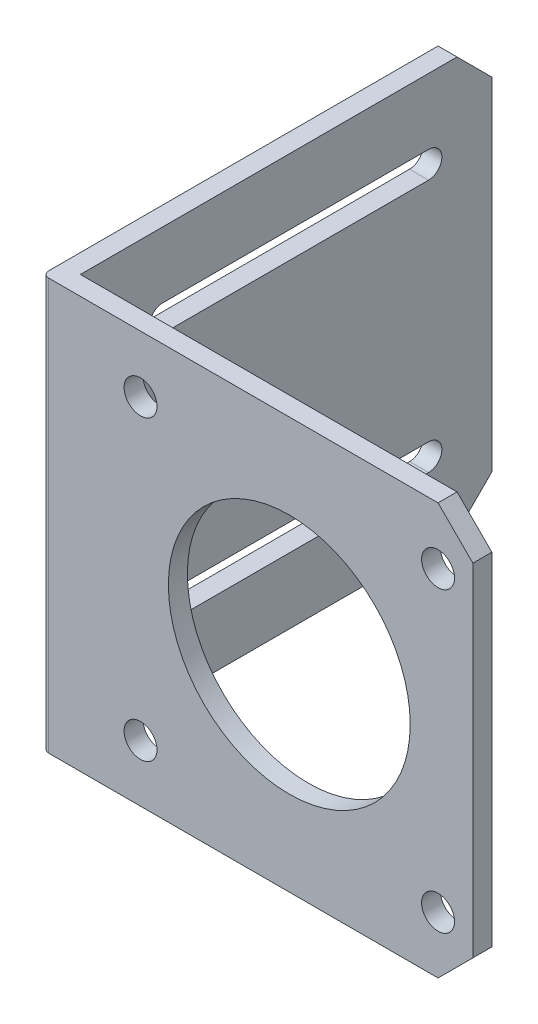
ISO-10303-21;
HEADER;
FILE_DESCRIPTION(('STEP AP214'),'2;1');
FILE_NAME('part.step','',(''),(''),'','','');
FILE_SCHEMA(('AUTOMOTIVE_DESIGN { 1 0 10303 214 1 1 1 1 }'));
ENDSEC;
DATA;
#1=APPLICATION_CONTEXT('core data for automotive mechanical design processes');
#2=APPLICATION_PROTOCOL_DEFINITION('international standard','automotive_design',2000,#1);
#3=PRODUCT_CONTEXT('',#1,'mechanical');
#4=PRODUCT('Part','Part','',(#3));
#5=PRODUCT_RELATED_PRODUCT_CATEGORY('part','',(#4));
#6=PRODUCT_DEFINITION_FORMATION('','',#4);
#7=PRODUCT_DEFINITION_CONTEXT('part definition',#1,'design');
#8=PRODUCT_DEFINITION('design','',#6,#7);
#9=PRODUCT_DEFINITION_SHAPE('','',#8);
#10=(LENGTH_UNIT() NAMED_UNIT(*) SI_UNIT(.MILLI.,.METRE.));
#11=(NAMED_UNIT(*) PLANE_ANGLE_UNIT() SI_UNIT($,.RADIAN.));
#12=(NAMED_UNIT(*) SI_UNIT($,.STERADIAN.) SOLID_ANGLE_UNIT());
#13=UNCERTAINTY_MEASURE_WITH_UNIT(LENGTH_MEASURE(1.E-05),#10,'distance_accuracy_value','');
#14=(GEOMETRIC_REPRESENTATION_CONTEXT(3) GLOBAL_UNCERTAINTY_ASSIGNED_CONTEXT((#13)) GLOBAL_UNIT_ASSIGNED_CONTEXT((#10,
#11,#12)) REPRESENTATION_CONTEXT('',''));
#15=CARTESIAN_POINT('',(0.,0.,0.));
#16=DIRECTION('',(0.,0.,1.));
#17=DIRECTION('',(1.,0.,0.));
#18=AXIS2_PLACEMENT_3D('',#15,#16,#17);
#19=CARTESIAN_POINT('',(68.,-32.5,-34.));
#20=DIRECTION('',(0.,0.,1.));
#21=DIRECTION('',(1.,0.,0.));
#22=AXIS2_PLACEMENT_3D('',#19,#20,#21);
#23=PLANE('',#22);
#24=DIRECTION('',(0.,1.,0.));
#25=VECTOR('',#24,1.);
#26=CARTESIAN_POINT('',(0.,-32.5,-34.));
#27=LINE('',#26,#25);
#28=CARTESIAN_POINT('',(0.,-27.,-34.));
#29=VERTEX_POINT('',#28);
#30=CARTESIAN_POINT('',(0.,27.,-34.));
#31=VERTEX_POINT('',#30);
#32=EDGE_CURVE('E195',#29,#31,#27,.T.);
#33=ORIENTED_EDGE('',*,*,#32,.T.);
#34=DIRECTION('',(1.,0.,0.));
#35=VECTOR('',#34,1.);
#36=CARTESIAN_POINT('',(-48.,27.,-34.));
#37=LINE('',#36,#35);
#38=CARTESIAN_POINT('',(3.,27.,-34.));
#39=VERTEX_POINT('',#38);
#40=EDGE_CURVE('E179',#31,#39,#37,.T.);
#41=ORIENTED_EDGE('',*,*,#40,.T.);
#42=DIRECTION('',(0.,1.,0.));
#43=VECTOR('',#42,1.);
#44=CARTESIAN_POINT('',(3.,-32.5,-34.));
#45=LINE('',#44,#43);
#46=CARTESIAN_POINT('',(3.,-27.,-34.));
#47=VERTEX_POINT('',#46);
#48=EDGE_CURVE('E193',#47,#39,#45,.T.);
#49=ORIENTED_EDGE('',*,*,#48,.F.);
#50=DIRECTION('',(1.,0.,0.));
#51=VECTOR('',#50,1.);
#52=CARTESIAN_POINT('',(-48.,-27.,-34.));
#53=LINE('',#52,#51);
#54=EDGE_CURVE('E325',#29,#47,#53,.T.);
#55=ORIENTED_EDGE('',*,*,#54,.F.);
#56=EDGE_LOOP('',(#33,#41,#49,#55));
#57=FACE_BOUND('',#56,.T.);
#58=ADVANCED_FACE('F45',(#57),#23,.F.);
#59=CARTESIAN_POINT('',(68.,-32.5,34.));
#60=DIRECTION('',(0.,0.,-1.));
#61=DIRECTION('',(-1.,0.,0.));
#62=AXIS2_PLACEMENT_3D('',#59,#60,#61);
#63=PLANE('',#62);
#64=CARTESIAN_POINT('',(15.5,-23.5,34.));
#65=DIRECTION('',(0.,0.,-1.));
#66=DIRECTION('',(-1.,0.,0.));
#67=AXIS2_PLACEMENT_3D('',#64,#65,#66);
#68=CIRCLE('',#67,2.6);
#69=CARTESIAN_POINT('',(12.9,-23.5,34.));
#70=VERTEX_POINT('',#69);
#71=EDGE_CURVE('E221',#70,#70,#68,.T.);
#72=ORIENTED_EDGE('',*,*,#71,.T.);
#73=EDGE_LOOP('',(#72));
#74=FACE_BOUND('',#73,.T.);
#75=CARTESIAN_POINT('',(39.,0.,34.));
#76=DIRECTION('',(0.,0.,-1.));
#77=DIRECTION('',(-1.,0.,0.));
#78=AXIS2_PLACEMENT_3D('',#75,#76,#77);
#79=CIRCLE('',#78,19.1);
#80=CARTESIAN_POINT('',(19.9,0.,34.));
#81=VERTEX_POINT('',#80);
#82=EDGE_CURVE('E423',#81,#81,#79,.T.);
#83=ORIENTED_EDGE('',*,*,#82,.T.);
#84=EDGE_LOOP('',(#83));
#85=FACE_BOUND('',#84,.T.);
#86=CARTESIAN_POINT('',(15.5,23.5,34.));
#87=DIRECTION('',(0.,0.,-1.));
#88=DIRECTION('',(-1.,0.,0.));
#89=AXIS2_PLACEMENT_3D('',#86,#87,#88);
#90=CIRCLE('',#89,2.6);
#91=CARTESIAN_POINT('',(12.9,23.5,34.));
#92=VERTEX_POINT('',#91);
#93=EDGE_CURVE('E419',#92,#92,#90,.T.);
#94=ORIENTED_EDGE('',*,*,#93,.T.);
#95=EDGE_LOOP('',(#94));
#96=FACE_BOUND('',#95,.T.);
#97=CARTESIAN_POINT('',(62.5,-23.5,34.));
#98=DIRECTION('',(0.,0.,-1.));
#99=DIRECTION('',(-1.,0.,0.));
#100=AXIS2_PLACEMENT_3D('',#97,#98,#99);
#101=CIRCLE('',#100,2.6);
#102=CARTESIAN_POINT('',(59.9,-23.5,34.));
#103=VERTEX_POINT('',#102);
#104=EDGE_CURVE('E415',#103,#103,#101,.T.);
#105=ORIENTED_EDGE('',*,*,#104,.T.);
#106=EDGE_LOOP('',(#105));
#107=FACE_BOUND('',#106,.T.);
#108=CARTESIAN_POINT('',(62.5,23.5,34.));
#109=DIRECTION('',(0.,0.,-1.));
#110=DIRECTION('',(-1.,0.,0.));
#111=AXIS2_PLACEMENT_3D('',#108,#109,#110);
#112=CIRCLE('',#111,2.6);
#113=CARTESIAN_POINT('',(59.9,23.5,34.));
#114=VERTEX_POINT('',#113);
#115=EDGE_CURVE('E407',#114,#114,#112,.T.);
#116=ORIENTED_EDGE('',*,*,#115,.T.);
#117=EDGE_LOOP('',(#116));
#118=FACE_BOUND('',#117,.T.);
#119=DIRECTION('',(0.,-1.,0.));
#120=VECTOR('',#119,1.);
#121=CARTESIAN_POINT('',(68.,-32.5,34.));
#122=LINE('',#121,#120);
#123=CARTESIAN_POINT('',(68.,27.,34.));
#124=VERTEX_POINT('',#123);
#125=CARTESIAN_POINT('',(68.,-27.,34.));
#126=VERTEX_POINT('',#125);
#127=EDGE_CURVE('E226',#124,#126,#122,.T.);
#128=ORIENTED_EDGE('',*,*,#127,.F.);
#129=DIRECTION('',(-0.707106781186548,0.707106781186548,0.));
#130=VECTOR('',#129,1.);
#131=CARTESIAN_POINT('',(97.75,-2.75,34.));
#132=LINE('',#131,#130);
#133=CARTESIAN_POINT('',(62.5,32.5,34.));
#134=VERTEX_POINT('',#133);
#135=EDGE_CURVE('E427',#124,#134,#132,.T.);
#136=ORIENTED_EDGE('',*,*,#135,.T.);
#137=DIRECTION('',(-1.,0.,0.));
#138=VECTOR('',#137,1.);
#139=CARTESIAN_POINT('',(68.,32.5,34.));
#140=LINE('',#139,#138);
#141=CARTESIAN_POINT('',(1.,32.5,34.));
#142=VERTEX_POINT('',#141);
#143=EDGE_CURVE('E230',#134,#142,#140,.T.);
#144=ORIENTED_EDGE('',*,*,#143,.T.);
#145=DIRECTION('',(0.,-1.,0.));
#146=VECTOR('',#145,1.);
#147=CARTESIAN_POINT('',(1.,-32.5,34.));
#148=LINE('',#147,#146);
#149=CARTESIAN_POINT('',(1.,-32.5,34.));
#150=VERTEX_POINT('',#149);
#151=EDGE_CURVE('E244',#142,#150,#148,.T.);
#152=ORIENTED_EDGE('',*,*,#151,.T.);
#153=DIRECTION('',(-1.,0.,0.));
#154=VECTOR('',#153,1.);
#155=CARTESIAN_POINT('',(68.,-32.5,34.));
#156=LINE('',#155,#154);
#157=CARTESIAN_POINT('',(62.5,-32.5,34.));
#158=VERTEX_POINT('',#157);
#159=EDGE_CURVE('E241',#158,#150,#156,.T.);
#160=ORIENTED_EDGE('',*,*,#159,.F.);
#161=DIRECTION('',(0.707106781186548,0.707106781186548,0.));
#162=VECTOR('',#161,1.);
#163=CARTESIAN_POINT('',(65.25,-29.75,34.));
#164=LINE('',#163,#162);
#165=EDGE_CURVE('E411',#158,#126,#164,.T.);
#166=ORIENTED_EDGE('',*,*,#165,.T.);
#167=EDGE_LOOP('',(#128,#136,#144,#152,#160,#166));
#168=FACE_BOUND('',#167,.T.);
#169=ADVANCED_FACE('F462',(#74,#85,#96,#107,#118,#168),#63,.F.);
#170=CARTESIAN_POINT('',(68.,-32.5,-34.));
#171=DIRECTION('',(0.,1.,0.));
#172=DIRECTION('',(0.,0.,1.));
#173=AXIS2_PLACEMENT_3D('',#170,#171,#172);
#174=PLANE('',#173);
#175=DIRECTION('',(0.,0.,-1.));
#176=VECTOR('',#175,1.);
#177=CARTESIAN_POINT('',(0.,-32.5,-34.));
#178=LINE('',#177,#176);
#179=CARTESIAN_POINT('',(0.,-32.5,33.));
#180=VERTEX_POINT('',#179);
#181=CARTESIAN_POINT('',(0.,-32.5,-28.5));
#182=VERTEX_POINT('',#181);
#183=EDGE_CURVE('E224',#180,#182,#178,.T.);
#184=ORIENTED_EDGE('',*,*,#183,.T.);
#185=DIRECTION('',(1.,0.,0.));
#186=VECTOR('',#185,1.);
#187=CARTESIAN_POINT('',(-48.,-32.5,-28.5));
#188=LINE('',#187,#186);
#189=CARTESIAN_POINT('',(3.,-32.5,-28.5));
#190=VERTEX_POINT('',#189);
#191=EDGE_CURVE('E328',#182,#190,#188,.T.);
#192=ORIENTED_EDGE('',*,*,#191,.T.);
#193=DIRECTION('',(0.,0.,-1.));
#194=VECTOR('',#193,1.);
#195=CARTESIAN_POINT('',(3.,-32.5,31.));
#196=LINE('',#195,#194);
#197=CARTESIAN_POINT('',(3.,-32.5,31.));
#198=VERTEX_POINT('',#197);
#199=EDGE_CURVE('E205',#198,#190,#196,.T.);
#200=ORIENTED_EDGE('',*,*,#199,.F.);
#201=DIRECTION('',(1.,0.,0.));
#202=VECTOR('',#201,1.);
#203=CARTESIAN_POINT('',(3.,-32.5,31.));
#204=LINE('',#203,#202);
#205=CARTESIAN_POINT('',(62.5,-32.5,31.));
#206=VERTEX_POINT('',#205);
#207=EDGE_CURVE('E210',#198,#206,#204,.T.);
#208=ORIENTED_EDGE('',*,*,#207,.T.);
#209=DIRECTION('',(0.,0.,-1.));
#210=VECTOR('',#209,1.);
#211=CARTESIAN_POINT('',(62.5,-32.5,82.));
#212=LINE('',#211,#210);
#213=EDGE_CURVE('E375',#158,#206,#212,.T.);
#214=ORIENTED_EDGE('',*,*,#213,.F.);
#215=ORIENTED_EDGE('',*,*,#159,.T.);
#216=CARTESIAN_POINT('',(1.,-32.5,33.));
#217=DIRECTION('',(0.,1.,0.));
#218=DIRECTION('',(0.,0.,1.));
#219=AXIS2_PLACEMENT_3D('',#216,#217,#218);
#220=CIRCLE('',#219,1.);
#221=EDGE_CURVE('E248',#150,#180,#220,.F.);
#222=ORIENTED_EDGE('',*,*,#221,.T.);
#223=EDGE_LOOP('',(#184,#192,#200,#208,#214,#215,#222));
#224=FACE_BOUND('',#223,.T.);
#225=ADVANCED_FACE('F441',(#224),#174,.F.);
#226=CARTESIAN_POINT('',(68.,32.5,-34.));
#227=DIRECTION('',(0.,-1.,0.));
#228=DIRECTION('',(0.,0.,-1.));
#229=AXIS2_PLACEMENT_3D('',#226,#227,#228);
#230=PLANE('',#229);
#231=DIRECTION('',(0.,0.,1.));
#232=VECTOR('',#231,1.);
#233=CARTESIAN_POINT('',(3.,32.5,-34.));
#234=LINE('',#233,#232);
#235=CARTESIAN_POINT('',(3.,32.5,-28.5));
#236=VERTEX_POINT('',#235);
#237=CARTESIAN_POINT('',(3.,32.5,31.));
#238=VERTEX_POINT('',#237);
#239=EDGE_CURVE('E220',#236,#238,#234,.T.);
#240=ORIENTED_EDGE('',*,*,#239,.F.);
#241=DIRECTION('',(1.,0.,0.));
#242=VECTOR('',#241,1.);
#243=CARTESIAN_POINT('',(-48.,32.5,-28.5));
#244=LINE('',#243,#242);
#245=CARTESIAN_POINT('',(0.,32.5,-28.5));
#246=VERTEX_POINT('',#245);
#247=EDGE_CURVE('E182',#246,#236,#244,.T.);
#248=ORIENTED_EDGE('',*,*,#247,.F.);
#249=DIRECTION('',(0.,0.,1.));
#250=VECTOR('',#249,1.);
#251=CARTESIAN_POINT('',(0.,32.5,-34.));
#252=LINE('',#251,#250);
#253=CARTESIAN_POINT('',(0.,32.5,33.));
#254=VERTEX_POINT('',#253);
#255=EDGE_CURVE('E231',#246,#254,#252,.T.);
#256=ORIENTED_EDGE('',*,*,#255,.T.);
#257=CARTESIAN_POINT('',(1.,32.5,33.));
#258=DIRECTION('',(0.,-1.,0.));
#259=DIRECTION('',(0.,0.,-1.));
#260=AXIS2_PLACEMENT_3D('',#257,#258,#259);
#261=CIRCLE('',#260,1.);
#262=EDGE_CURVE('E11',#254,#142,#261,.F.);
#263=ORIENTED_EDGE('',*,*,#262,.T.);
#264=ORIENTED_EDGE('',*,*,#143,.F.);
#265=DIRECTION('',(0.,0.,-1.));
#266=VECTOR('',#265,1.);
#267=CARTESIAN_POINT('',(62.5,32.5,82.));
#268=LINE('',#267,#266);
#269=CARTESIAN_POINT('',(62.5,32.5,31.));
#270=VERTEX_POINT('',#269);
#271=EDGE_CURVE('E387',#134,#270,#268,.T.);
#272=ORIENTED_EDGE('',*,*,#271,.T.);
#273=DIRECTION('',(1.,0.,0.));
#274=VECTOR('',#273,1.);
#275=CARTESIAN_POINT('',(3.,32.5,31.));
#276=LINE('',#275,#274);
#277=EDGE_CURVE('E204',#238,#270,#276,.T.);
#278=ORIENTED_EDGE('',*,*,#277,.F.);
#279=EDGE_LOOP('',(#240,#248,#256,#263,#264,#272,#278));
#280=FACE_BOUND('',#279,.T.);
#281=ADVANCED_FACE('F264',(#280),#230,.F.);
#282=CARTESIAN_POINT('',(68.,0.,0.));
#283=DIRECTION('',(1.,0.,0.));
#284=DIRECTION('',(0.,0.,-1.));
#285=AXIS2_PLACEMENT_3D('',#282,#283,#284);
#286=PLANE('',#285);
#287=DIRECTION('',(0.,0.,-1.));
#288=VECTOR('',#287,1.);
#289=CARTESIAN_POINT('',(68.,27.,82.));
#290=LINE('',#289,#288);
#291=CARTESIAN_POINT('',(68.,27.,31.));
#292=VERTEX_POINT('',#291);
#293=EDGE_CURVE('E383',#124,#292,#290,.T.);
#294=ORIENTED_EDGE('',*,*,#293,.F.);
#295=ORIENTED_EDGE('',*,*,#127,.T.);
#296=DIRECTION('',(0.,0.,-1.));
#297=VECTOR('',#296,1.);
#298=CARTESIAN_POINT('',(68.,-27.,82.));
#299=LINE('',#298,#297);
#300=CARTESIAN_POINT('',(68.,-27.,31.));
#301=VERTEX_POINT('',#300);
#302=EDGE_CURVE('E368',#126,#301,#299,.T.);
#303=ORIENTED_EDGE('',*,*,#302,.T.);
#304=DIRECTION('',(0.,-1.,0.));
#305=VECTOR('',#304,1.);
#306=CARTESIAN_POINT('',(68.,32.5,31.));
#307=LINE('',#306,#305);
#308=EDGE_CURVE('E216',#292,#301,#307,.T.);
#309=ORIENTED_EDGE('',*,*,#308,.F.);
#310=EDGE_LOOP('',(#294,#295,#303,#309));
#311=FACE_BOUND('',#310,.T.);
#312=ADVANCED_FACE('F475',(#311),#286,.T.);
#313=CARTESIAN_POINT('',(0.,0.,0.));
#314=DIRECTION('',(1.,0.,0.));
#315=DIRECTION('',(0.,0.,-1.));
#316=AXIS2_PLACEMENT_3D('',#313,#314,#315);
#317=PLANE('',#316);
#318=DIRECTION('',(0.,0.,1.));
#319=VECTOR('',#318,1.);
#320=CARTESIAN_POINT('',(0.,22.1,0.));
#321=LINE('',#320,#319);
#322=CARTESIAN_POINT('',(0.,22.1,-24.));
#323=VERTEX_POINT('',#322);
#324=CARTESIAN_POINT('',(0.,22.1,18.));
#325=VERTEX_POINT('',#324);
#326=EDGE_CURVE('E357',#323,#325,#321,.T.);
#327=ORIENTED_EDGE('',*,*,#326,.T.);
#328=CARTESIAN_POINT('',(0.,20.,18.));
#329=DIRECTION('',(1.,0.,0.));
#330=DIRECTION('',(0.,0.,-1.));
#331=AXIS2_PLACEMENT_3D('',#328,#329,#330);
#332=CIRCLE('',#331,2.1);
#333=CARTESIAN_POINT('',(0.,17.9,18.));
#334=VERTEX_POINT('',#333);
#335=EDGE_CURVE('E361',#325,#334,#332,.T.);
#336=ORIENTED_EDGE('',*,*,#335,.T.);
#337=DIRECTION('',(0.,0.,-1.));
#338=VECTOR('',#337,1.);
#339=CARTESIAN_POINT('',(0.,17.9,0.));
#340=LINE('',#339,#338);
#341=CARTESIAN_POINT('',(0.,17.9,-24.));
#342=VERTEX_POINT('',#341);
#343=EDGE_CURVE('E349',#334,#342,#340,.T.);
#344=ORIENTED_EDGE('',*,*,#343,.T.);
#345=CARTESIAN_POINT('',(0.,20.,-24.));
#346=DIRECTION('',(1.,0.,0.));
#347=DIRECTION('',(0.,0.,-1.));
#348=AXIS2_PLACEMENT_3D('',#345,#346,#347);
#349=CIRCLE('',#348,2.1);
#350=EDGE_CURVE('E353',#342,#323,#349,.T.);
#351=ORIENTED_EDGE('',*,*,#350,.T.);
#352=EDGE_LOOP('',(#327,#336,#344,#351));
#353=FACE_BOUND('',#352,.T.);
#354=DIRECTION('',(0.,0.,1.));
#355=VECTOR('',#354,1.);
#356=CARTESIAN_POINT('',(0.,-17.9,0.));
#357=LINE('',#356,#355);
#358=CARTESIAN_POINT('',(0.,-17.9,-24.));
#359=VERTEX_POINT('',#358);
#360=CARTESIAN_POINT('',(0.,-17.9,18.));
#361=VERTEX_POINT('',#360);
#362=EDGE_CURVE('E341',#359,#361,#357,.T.);
#363=ORIENTED_EDGE('',*,*,#362,.T.);
#364=CARTESIAN_POINT('',(0.,-20.,18.));
#365=DIRECTION('',(1.,0.,0.));
#366=DIRECTION('',(0.,0.,-1.));
#367=AXIS2_PLACEMENT_3D('',#364,#365,#366);
#368=CIRCLE('',#367,2.1);
#369=CARTESIAN_POINT('',(0.,-22.1,18.));
#370=VERTEX_POINT('',#369);
#371=EDGE_CURVE('E345',#361,#370,#368,.T.);
#372=ORIENTED_EDGE('',*,*,#371,.T.);
#373=DIRECTION('',(0.,0.,-1.));
#374=VECTOR('',#373,1.);
#375=CARTESIAN_POINT('',(0.,-22.1,0.));
#376=LINE('',#375,#374);
#377=CARTESIAN_POINT('',(0.,-22.1,-24.));
#378=VERTEX_POINT('',#377);
#379=EDGE_CURVE('E271',#370,#378,#376,.T.);
#380=ORIENTED_EDGE('',*,*,#379,.T.);
#381=CARTESIAN_POINT('',(0.,-20.,-24.));
#382=DIRECTION('',(1.,0.,0.));
#383=DIRECTION('',(0.,0.,-1.));
#384=AXIS2_PLACEMENT_3D('',#381,#382,#383);
#385=CIRCLE('',#384,2.1);
#386=EDGE_CURVE('E337',#378,#359,#385,.T.);
#387=ORIENTED_EDGE('',*,*,#386,.T.);
#388=EDGE_LOOP('',(#363,#372,#380,#387));
#389=FACE_BOUND('',#388,.T.);
#390=ORIENTED_EDGE('',*,*,#255,.F.);
#391=DIRECTION('',(0.,-0.707106781186548,-0.707106781186548));
#392=VECTOR('',#391,1.);
#393=CARTESIAN_POINT('',(0.,30.5,-30.5));
#394=LINE('',#393,#392);
#395=EDGE_CURVE('E365',#246,#31,#394,.T.);
#396=ORIENTED_EDGE('',*,*,#395,.T.);
#397=ORIENTED_EDGE('',*,*,#32,.F.);
#398=DIRECTION('',(0.,-0.707106781186547,0.707106781186548));
#399=VECTOR('',#398,1.);
#400=CARTESIAN_POINT('',(0.,-30.5,-30.5));
#401=LINE('',#400,#399);
#402=EDGE_CURVE('E268',#29,#182,#401,.T.);
#403=ORIENTED_EDGE('',*,*,#402,.T.);
#404=ORIENTED_EDGE('',*,*,#183,.F.);
#405=DIRECTION('',(0.,-1.,0.));
#406=VECTOR('',#405,1.);
#407=CARTESIAN_POINT('',(0.,0.,33.));
#408=LINE('',#407,#406);
#409=EDGE_CURVE('E54',#180,#254,#408,.F.);
#410=ORIENTED_EDGE('',*,*,#409,.T.);
#411=EDGE_LOOP('',(#390,#396,#397,#403,#404,#410));
#412=FACE_BOUND('',#411,.T.);
#413=ADVANCED_FACE('F257',(#353,#389,#412),#317,.F.);
#414=CARTESIAN_POINT('',(3.,32.5,31.));
#415=DIRECTION('',(0.,0.,1.));
#416=DIRECTION('',(1.,0.,0.));
#417=AXIS2_PLACEMENT_3D('',#414,#415,#416);
#418=PLANE('',#417);
#419=CARTESIAN_POINT('',(15.5,-23.5,31.));
#420=DIRECTION('',(0.,0.,-1.));
#421=DIRECTION('',(1.,0.,0.));
#422=AXIS2_PLACEMENT_3D('',#419,#420,#421);
#423=CIRCLE('',#422,2.6);
#424=CARTESIAN_POINT('',(18.1,-23.5,31.));
#425=VERTEX_POINT('',#424);
#426=EDGE_CURVE('E373',#425,#425,#423,.T.);
#427=ORIENTED_EDGE('',*,*,#426,.F.);
#428=EDGE_LOOP('',(#427));
#429=FACE_BOUND('',#428,.T.);
#430=CARTESIAN_POINT('',(39.,0.,31.));
#431=DIRECTION('',(0.,0.,-1.));
#432=DIRECTION('',(-1.,0.,0.));
#433=AXIS2_PLACEMENT_3D('',#430,#431,#432);
#434=CIRCLE('',#433,19.1);
#435=CARTESIAN_POINT('',(19.9,0.,31.));
#436=VERTEX_POINT('',#435);
#437=EDGE_CURVE('E392',#436,#436,#434,.T.);
#438=ORIENTED_EDGE('',*,*,#437,.F.);
#439=EDGE_LOOP('',(#438));
#440=FACE_BOUND('',#439,.T.);
#441=CARTESIAN_POINT('',(15.5,23.5,31.));
#442=DIRECTION('',(0.,0.,-1.));
#443=DIRECTION('',(-1.,0.,0.));
#444=AXIS2_PLACEMENT_3D('',#441,#442,#443);
#445=CIRCLE('',#444,2.6);
#446=CARTESIAN_POINT('',(12.9,23.5,31.));
#447=VERTEX_POINT('',#446);
#448=EDGE_CURVE('E396',#447,#447,#445,.T.);
#449=ORIENTED_EDGE('',*,*,#448,.F.);
#450=EDGE_LOOP('',(#449));
#451=FACE_BOUND('',#450,.T.);
#452=CARTESIAN_POINT('',(62.5,-23.5,31.));
#453=DIRECTION('',(0.,0.,-1.));
#454=DIRECTION('',(1.,0.,0.));
#455=AXIS2_PLACEMENT_3D('',#452,#453,#454);
#456=CIRCLE('',#455,2.6);
#457=CARTESIAN_POINT('',(65.1,-23.5,31.));
#458=VERTEX_POINT('',#457);
#459=EDGE_CURVE('E369',#458,#458,#456,.T.);
#460=ORIENTED_EDGE('',*,*,#459,.F.);
#461=EDGE_LOOP('',(#460));
#462=FACE_BOUND('',#461,.T.);
#463=CARTESIAN_POINT('',(62.5,23.5,31.));
#464=DIRECTION('',(0.,0.,-1.));
#465=DIRECTION('',(-1.,0.,0.));
#466=AXIS2_PLACEMENT_3D('',#463,#464,#465);
#467=CIRCLE('',#466,2.6);
#468=CARTESIAN_POINT('',(59.9,23.5,31.));
#469=VERTEX_POINT('',#468);
#470=EDGE_CURVE('E400',#469,#469,#467,.T.);
#471=ORIENTED_EDGE('',*,*,#470,.F.);
#472=EDGE_LOOP('',(#471));
#473=FACE_BOUND('',#472,.T.);
#474=ORIENTED_EDGE('',*,*,#277,.T.);
#475=DIRECTION('',(-0.707106781186547,0.707106781186547,0.));
#476=VECTOR('',#475,1.);
#477=CARTESIAN_POINT('',(68.,27.,31.));
#478=LINE('',#477,#476);
#479=EDGE_CURVE('E386',#292,#270,#478,.T.);
#480=ORIENTED_EDGE('',*,*,#479,.F.);
#481=ORIENTED_EDGE('',*,*,#308,.T.);
#482=DIRECTION('',(0.707106781186547,0.707106781186547,0.));
#483=VECTOR('',#482,1.);
#484=CARTESIAN_POINT('',(68.,-27.,31.));
#485=LINE('',#484,#483);
#486=EDGE_CURVE('E374',#206,#301,#485,.T.);
#487=ORIENTED_EDGE('',*,*,#486,.F.);
#488=ORIENTED_EDGE('',*,*,#207,.F.);
#489=DIRECTION('',(0.,-1.,0.));
#490=VECTOR('',#489,1.);
#491=CARTESIAN_POINT('',(3.,32.5,31.));
#492=LINE('',#491,#490);
#493=EDGE_CURVE('E212',#238,#198,#492,.T.);
#494=ORIENTED_EDGE('',*,*,#493,.F.);
#495=EDGE_LOOP('',(#474,#480,#481,#487,#488,#494));
#496=FACE_BOUND('',#495,.T.);
#497=ADVANCED_FACE('F484',(#429,#440,#451,#462,#473,#496),#418,.F.);
#498=CARTESIAN_POINT('',(3.,0.,0.));
#499=DIRECTION('',(1.,0.,0.));
#500=DIRECTION('',(0.,0.,-1.));
#501=AXIS2_PLACEMENT_3D('',#498,#499,#500);
#502=PLANE('',#501);
#503=DIRECTION('',(0.,-0.707106781186547,-0.707106781186547));
#504=VECTOR('',#503,1.);
#505=CARTESIAN_POINT('',(3.,27.,-34.));
#506=LINE('',#505,#504);
#507=EDGE_CURVE('E176',#236,#39,#506,.T.);
#508=ORIENTED_EDGE('',*,*,#507,.F.);
#509=ORIENTED_EDGE('',*,*,#239,.T.);
#510=ORIENTED_EDGE('',*,*,#493,.T.);
#511=ORIENTED_EDGE('',*,*,#199,.T.);
#512=DIRECTION('',(0.,-0.707106781186547,0.707106781186548));
#513=VECTOR('',#512,1.);
#514=CARTESIAN_POINT('',(3.,-27.,-34.));
#515=LINE('',#514,#513);
#516=EDGE_CURVE('E202',#47,#190,#515,.T.);
#517=ORIENTED_EDGE('',*,*,#516,.F.);
#518=ORIENTED_EDGE('',*,*,#48,.T.);
#519=EDGE_LOOP('',(#508,#509,#510,#511,#517,#518));
#520=FACE_BOUND('',#519,.T.);
#521=CARTESIAN_POINT('',(3.,20.,18.));
#522=DIRECTION('',(1.,0.,0.));
#523=DIRECTION('',(0.,0.,1.));
#524=AXIS2_PLACEMENT_3D('',#521,#522,#523);
#525=CIRCLE('',#524,2.1);
#526=CARTESIAN_POINT('',(3.,22.1,18.));
#527=VERTEX_POINT('',#526);
#528=CARTESIAN_POINT('',(3.,17.9,18.));
#529=VERTEX_POINT('',#528);
#530=EDGE_CURVE('E187',#527,#529,#525,.T.);
#531=ORIENTED_EDGE('',*,*,#530,.F.);
#532=DIRECTION('',(0.,0.,1.));
#533=VECTOR('',#532,1.);
#534=CARTESIAN_POINT('',(3.,22.1,18.));
#535=LINE('',#534,#533);
#536=CARTESIAN_POINT('',(3.,22.1,-24.));
#537=VERTEX_POINT('',#536);
#538=EDGE_CURVE('E278',#537,#527,#535,.T.);
#539=ORIENTED_EDGE('',*,*,#538,.F.);
#540=CARTESIAN_POINT('',(3.,20.,-24.));
#541=DIRECTION('',(1.,0.,0.));
#542=DIRECTION('',(0.,0.,-1.));
#543=AXIS2_PLACEMENT_3D('',#540,#541,#542);
#544=CIRCLE('',#543,2.1);
#545=CARTESIAN_POINT('',(3.,17.9,-24.));
#546=VERTEX_POINT('',#545);
#547=EDGE_CURVE('E291',#546,#537,#544,.T.);
#548=ORIENTED_EDGE('',*,*,#547,.F.);
#549=DIRECTION('',(0.,0.,-1.));
#550=VECTOR('',#549,1.);
#551=CARTESIAN_POINT('',(3.,17.9,18.));
#552=LINE('',#551,#550);
#553=EDGE_CURVE('E295',#529,#546,#552,.T.);
#554=ORIENTED_EDGE('',*,*,#553,.F.);
#555=EDGE_LOOP('',(#531,#539,#548,#554));
#556=FACE_BOUND('',#555,.T.);
#557=CARTESIAN_POINT('',(3.,-20.,18.));
#558=DIRECTION('',(1.,0.,0.));
#559=DIRECTION('',(0.,0.,-1.));
#560=AXIS2_PLACEMENT_3D('',#557,#558,#559);
#561=CIRCLE('',#560,2.1);
#562=CARTESIAN_POINT('',(3.,-17.9,18.));
#563=VERTEX_POINT('',#562);
#564=CARTESIAN_POINT('',(3.,-22.1,18.));
#565=VERTEX_POINT('',#564);
#566=EDGE_CURVE('E287',#563,#565,#561,.T.);
#567=ORIENTED_EDGE('',*,*,#566,.F.);
#568=DIRECTION('',(0.,0.,1.));
#569=VECTOR('',#568,1.);
#570=CARTESIAN_POINT('',(3.,-17.9,18.));
#571=LINE('',#570,#569);
#572=CARTESIAN_POINT('',(3.,-17.9,-24.));
#573=VERTEX_POINT('',#572);
#574=EDGE_CURVE('E304',#573,#563,#571,.T.);
#575=ORIENTED_EDGE('',*,*,#574,.F.);
#576=CARTESIAN_POINT('',(3.,-20.,-24.));
#577=DIRECTION('',(1.,0.,0.));
#578=DIRECTION('',(0.,0.,1.));
#579=AXIS2_PLACEMENT_3D('',#576,#577,#578);
#580=CIRCLE('',#579,2.1);
#581=CARTESIAN_POINT('',(3.,-22.1,-24.));
#582=VERTEX_POINT('',#581);
#583=EDGE_CURVE('E316',#582,#573,#580,.T.);
#584=ORIENTED_EDGE('',*,*,#583,.F.);
#585=DIRECTION('',(0.,0.,-1.));
#586=VECTOR('',#585,1.);
#587=CARTESIAN_POINT('',(3.,-22.1,18.));
#588=LINE('',#587,#586);
#589=EDGE_CURVE('E320',#565,#582,#588,.T.);
#590=ORIENTED_EDGE('',*,*,#589,.F.);
#591=EDGE_LOOP('',(#567,#575,#584,#590));
#592=FACE_BOUND('',#591,.T.);
#593=ADVANCED_FACE('F199',(#520,#556,#592),#502,.T.);
#594=CARTESIAN_POINT('',(1.,-32.5,33.));
#595=DIRECTION('',(0.,-1.,0.));
#596=DIRECTION('',(0.,0.,-1.));
#597=AXIS2_PLACEMENT_3D('',#594,#595,#596);
#598=CYLINDRICAL_SURFACE('',#597,1.);
#599=ORIENTED_EDGE('',*,*,#262,.F.);
#600=ORIENTED_EDGE('',*,*,#409,.F.);
#601=ORIENTED_EDGE('',*,*,#221,.F.);
#602=ORIENTED_EDGE('',*,*,#151,.F.);
#603=EDGE_LOOP('',(#599,#600,#601,#602));
#604=FACE_BOUND('',#603,.T.);
#605=ADVANCED_FACE('F47',(#604),#598,.T.);
#606=CARTESIAN_POINT('',(62.5,23.5,82.));
#607=DIRECTION('',(0.,0.,-1.));
#608=DIRECTION('',(-1.,0.,0.));
#609=AXIS2_PLACEMENT_3D('',#606,#607,#608);
#610=CYLINDRICAL_SURFACE('',#609,2.6);
#611=ORIENTED_EDGE('',*,*,#470,.T.);
#612=EDGE_LOOP('',(#611));
#613=FACE_BOUND('',#612,.T.);
#614=ORIENTED_EDGE('',*,*,#115,.F.);
#615=EDGE_LOOP('',(#614));
#616=FACE_BOUND('',#615,.T.);
#617=ADVANCED_FACE('F493',(#613,#616),#610,.F.);
#618=CARTESIAN_POINT('',(68.,-27.,82.));
#619=DIRECTION('',(-0.707106781186548,0.707106781186548,0.));
#620=DIRECTION('',(-0.707106781186548,-0.707106781186548,0.));
#621=AXIS2_PLACEMENT_3D('',#618,#619,#620);
#622=PLANE('',#621);
#623=ORIENTED_EDGE('',*,*,#213,.T.);
#624=ORIENTED_EDGE('',*,*,#486,.T.);
#625=ORIENTED_EDGE('',*,*,#302,.F.);
#626=ORIENTED_EDGE('',*,*,#165,.F.);
#627=EDGE_LOOP('',(#623,#624,#625,#626));
#628=FACE_BOUND('',#627,.T.);
#629=ADVANCED_FACE('F496',(#628),#622,.F.);
#630=CARTESIAN_POINT('',(62.5,-23.5,82.));
#631=DIRECTION('',(0.,0.,-1.));
#632=DIRECTION('',(-1.,0.,0.));
#633=AXIS2_PLACEMENT_3D('',#630,#631,#632);
#634=CYLINDRICAL_SURFACE('',#633,2.6);
#635=ORIENTED_EDGE('',*,*,#459,.T.);
#636=EDGE_LOOP('',(#635));
#637=FACE_BOUND('',#636,.T.);
#638=ORIENTED_EDGE('',*,*,#104,.F.);
#639=EDGE_LOOP('',(#638));
#640=FACE_BOUND('',#639,.T.);
#641=ADVANCED_FACE('F504',(#637,#640),#634,.F.);
#642=CARTESIAN_POINT('',(15.5,23.5,82.));
#643=DIRECTION('',(0.,0.,-1.));
#644=DIRECTION('',(-1.,0.,0.));
#645=AXIS2_PLACEMENT_3D('',#642,#643,#644);
#646=CYLINDRICAL_SURFACE('',#645,2.6);
#647=ORIENTED_EDGE('',*,*,#448,.T.);
#648=EDGE_LOOP('',(#647));
#649=FACE_BOUND('',#648,.T.);
#650=ORIENTED_EDGE('',*,*,#93,.F.);
#651=EDGE_LOOP('',(#650));
#652=FACE_BOUND('',#651,.T.);
#653=ADVANCED_FACE('F501',(#649,#652),#646,.F.);
#654=CARTESIAN_POINT('',(39.,0.,82.));
#655=DIRECTION('',(0.,0.,-1.));
#656=DIRECTION('',(-1.,0.,0.));
#657=AXIS2_PLACEMENT_3D('',#654,#655,#656);
#658=CYLINDRICAL_SURFACE('',#657,19.1);
#659=ORIENTED_EDGE('',*,*,#437,.T.);
#660=EDGE_LOOP('',(#659));
#661=FACE_BOUND('',#660,.T.);
#662=ORIENTED_EDGE('',*,*,#82,.F.);
#663=EDGE_LOOP('',(#662));
#664=FACE_BOUND('',#663,.T.);
#665=ADVANCED_FACE('F498',(#661,#664),#658,.F.);
#666=CARTESIAN_POINT('',(68.,27.,82.));
#667=DIRECTION('',(-0.707106781186548,-0.707106781186548,0.));
#668=DIRECTION('',(0.707106781186548,-0.707106781186548,0.));
#669=AXIS2_PLACEMENT_3D('',#666,#667,#668);
#670=PLANE('',#669);
#671=ORIENTED_EDGE('',*,*,#293,.T.);
#672=ORIENTED_EDGE('',*,*,#479,.T.);
#673=ORIENTED_EDGE('',*,*,#271,.F.);
#674=ORIENTED_EDGE('',*,*,#135,.F.);
#675=EDGE_LOOP('',(#671,#672,#673,#674));
#676=FACE_BOUND('',#675,.T.);
#677=ADVANCED_FACE('F456',(#676),#670,.F.);
#678=CARTESIAN_POINT('',(15.5,-23.5,82.));
#679=DIRECTION('',(0.,0.,-1.));
#680=DIRECTION('',(-1.,0.,0.));
#681=AXIS2_PLACEMENT_3D('',#678,#679,#680);
#682=CYLINDRICAL_SURFACE('',#681,2.6);
#683=ORIENTED_EDGE('',*,*,#426,.T.);
#684=EDGE_LOOP('',(#683));
#685=FACE_BOUND('',#684,.T.);
#686=ORIENTED_EDGE('',*,*,#71,.F.);
#687=EDGE_LOOP('',(#686));
#688=FACE_BOUND('',#687,.T.);
#689=ADVANCED_FACE('F447',(#685,#688),#682,.F.);
#690=CARTESIAN_POINT('',(-48.,-27.,-34.));
#691=DIRECTION('',(0.,0.707106781186548,0.707106781186547));
#692=DIRECTION('',(0.,-0.707106781186547,0.707106781186548));
#693=AXIS2_PLACEMENT_3D('',#690,#691,#692);
#694=PLANE('',#693);
#695=ORIENTED_EDGE('',*,*,#54,.T.);
#696=ORIENTED_EDGE('',*,*,#516,.T.);
#697=ORIENTED_EDGE('',*,*,#191,.F.);
#698=ORIENTED_EDGE('',*,*,#402,.F.);
#699=EDGE_LOOP('',(#695,#696,#697,#698));
#700=FACE_BOUND('',#699,.T.);
#701=ADVANCED_FACE('F444',(#700),#694,.F.);
#702=CARTESIAN_POINT('',(-48.,-20.,18.));
#703=DIRECTION('',(1.,0.,0.));
#704=DIRECTION('',(0.,0.,-1.));
#705=AXIS2_PLACEMENT_3D('',#702,#703,#704);
#706=CYLINDRICAL_SURFACE('',#705,2.1);
#707=DIRECTION('',(1.,0.,0.));
#708=VECTOR('',#707,1.);
#709=CARTESIAN_POINT('',(-48.,-17.9,18.));
#710=LINE('',#709,#708);
#711=EDGE_CURVE('E310',#361,#563,#710,.T.);
#712=ORIENTED_EDGE('',*,*,#711,.T.);
#713=ORIENTED_EDGE('',*,*,#566,.T.);
#714=DIRECTION('',(1.,0.,0.));
#715=VECTOR('',#714,1.);
#716=CARTESIAN_POINT('',(-48.,-22.1,18.));
#717=LINE('',#716,#715);
#718=EDGE_CURVE('E300',#370,#565,#717,.T.);
#719=ORIENTED_EDGE('',*,*,#718,.F.);
#720=ORIENTED_EDGE('',*,*,#371,.F.);
#721=EDGE_LOOP('',(#712,#713,#719,#720));
#722=FACE_BOUND('',#721,.T.);
#723=ADVANCED_FACE('F446',(#722),#706,.F.);
#724=CARTESIAN_POINT('',(-48.,-17.9,18.));
#725=DIRECTION('',(0.,1.,0.));
#726=DIRECTION('',(0.,0.,1.));
#727=AXIS2_PLACEMENT_3D('',#724,#725,#726);
#728=PLANE('',#727);
#729=DIRECTION('',(1.,0.,0.));
#730=VECTOR('',#729,1.);
#731=CARTESIAN_POINT('',(-48.,-17.9,-24.));
#732=LINE('',#731,#730);
#733=EDGE_CURVE('E307',#359,#573,#732,.T.);
#734=ORIENTED_EDGE('',*,*,#733,.T.);
#735=ORIENTED_EDGE('',*,*,#574,.T.);
#736=ORIENTED_EDGE('',*,*,#711,.F.);
#737=ORIENTED_EDGE('',*,*,#362,.F.);
#738=EDGE_LOOP('',(#734,#735,#736,#737));
#739=FACE_BOUND('',#738,.T.);
#740=ADVANCED_FACE('F453',(#739),#728,.F.);
#741=CARTESIAN_POINT('',(-48.,-20.,-24.));
#742=DIRECTION('',(1.,0.,0.));
#743=DIRECTION('',(0.,0.,-1.));
#744=AXIS2_PLACEMENT_3D('',#741,#742,#743);
#745=CYLINDRICAL_SURFACE('',#744,2.1);
#746=DIRECTION('',(1.,0.,0.));
#747=VECTOR('',#746,1.);
#748=CARTESIAN_POINT('',(-48.,-22.1,-24.));
#749=LINE('',#748,#747);
#750=EDGE_CURVE('E69',#378,#582,#749,.T.);
#751=ORIENTED_EDGE('',*,*,#750,.T.);
#752=ORIENTED_EDGE('',*,*,#583,.T.);
#753=ORIENTED_EDGE('',*,*,#733,.F.);
#754=ORIENTED_EDGE('',*,*,#386,.F.);
#755=EDGE_LOOP('',(#751,#752,#753,#754));
#756=FACE_BOUND('',#755,.T.);
#757=ADVANCED_FACE('F606',(#756),#745,.F.);
#758=CARTESIAN_POINT('',(-48.,-22.1,18.));
#759=DIRECTION('',(0.,-1.,0.));
#760=DIRECTION('',(0.,0.,-1.));
#761=AXIS2_PLACEMENT_3D('',#758,#759,#760);
#762=PLANE('',#761);
#763=ORIENTED_EDGE('',*,*,#718,.T.);
#764=ORIENTED_EDGE('',*,*,#589,.T.);
#765=ORIENTED_EDGE('',*,*,#750,.F.);
#766=ORIENTED_EDGE('',*,*,#379,.F.);
#767=EDGE_LOOP('',(#763,#764,#765,#766));
#768=FACE_BOUND('',#767,.T.);
#769=ADVANCED_FACE('F616',(#768),#762,.F.);
#770=CARTESIAN_POINT('',(-48.,20.,18.));
#771=DIRECTION('',(1.,0.,0.));
#772=DIRECTION('',(0.,0.,-1.));
#773=AXIS2_PLACEMENT_3D('',#770,#771,#772);
#774=CYLINDRICAL_SURFACE('',#773,2.1);
#775=DIRECTION('',(1.,0.,0.));
#776=VECTOR('',#775,1.);
#777=CARTESIAN_POINT('',(-48.,22.1,18.));
#778=LINE('',#777,#776);
#779=EDGE_CURVE('E284',#325,#527,#778,.T.);
#780=ORIENTED_EDGE('',*,*,#779,.T.);
#781=ORIENTED_EDGE('',*,*,#530,.T.);
#782=DIRECTION('',(1.,0.,0.));
#783=VECTOR('',#782,1.);
#784=CARTESIAN_POINT('',(-48.,17.9,18.));
#785=LINE('',#784,#783);
#786=EDGE_CURVE('E274',#334,#529,#785,.T.);
#787=ORIENTED_EDGE('',*,*,#786,.F.);
#788=ORIENTED_EDGE('',*,*,#335,.F.);
#789=EDGE_LOOP('',(#780,#781,#787,#788));
#790=FACE_BOUND('',#789,.T.);
#791=ADVANCED_FACE('F627',(#790),#774,.F.);
#792=CARTESIAN_POINT('',(-48.,22.1,18.));
#793=DIRECTION('',(0.,1.,0.));
#794=DIRECTION('',(0.,0.,1.));
#795=AXIS2_PLACEMENT_3D('',#792,#793,#794);
#796=PLANE('',#795);
#797=DIRECTION('',(1.,0.,0.));
#798=VECTOR('',#797,1.);
#799=CARTESIAN_POINT('',(-48.,22.1,-24.));
#800=LINE('',#799,#798);
#801=EDGE_CURVE('E281',#323,#537,#800,.T.);
#802=ORIENTED_EDGE('',*,*,#801,.T.);
#803=ORIENTED_EDGE('',*,*,#538,.T.);
#804=ORIENTED_EDGE('',*,*,#779,.F.);
#805=ORIENTED_EDGE('',*,*,#326,.F.);
#806=EDGE_LOOP('',(#802,#803,#804,#805));
#807=FACE_BOUND('',#806,.T.);
#808=ADVANCED_FACE('F637',(#807),#796,.F.);
#809=CARTESIAN_POINT('',(-48.,20.,-24.));
#810=DIRECTION('',(1.,0.,0.));
#811=DIRECTION('',(0.,0.,-1.));
#812=AXIS2_PLACEMENT_3D('',#809,#810,#811);
#813=CYLINDRICAL_SURFACE('',#812,2.1);
#814=DIRECTION('',(1.,0.,0.));
#815=VECTOR('',#814,1.);
#816=CARTESIAN_POINT('',(-48.,17.9,-24.));
#817=LINE('',#816,#815);
#818=EDGE_CURVE('E61',#342,#546,#817,.T.);
#819=ORIENTED_EDGE('',*,*,#818,.T.);
#820=ORIENTED_EDGE('',*,*,#547,.T.);
#821=ORIENTED_EDGE('',*,*,#801,.F.);
#822=ORIENTED_EDGE('',*,*,#350,.F.);
#823=EDGE_LOOP('',(#819,#820,#821,#822));
#824=FACE_BOUND('',#823,.T.);
#825=ADVANCED_FACE('F648',(#824),#813,.F.);
#826=CARTESIAN_POINT('',(-48.,17.9,18.));
#827=DIRECTION('',(0.,-1.,0.));
#828=DIRECTION('',(0.,0.,-1.));
#829=AXIS2_PLACEMENT_3D('',#826,#827,#828);
#830=PLANE('',#829);
#831=ORIENTED_EDGE('',*,*,#786,.T.);
#832=ORIENTED_EDGE('',*,*,#553,.T.);
#833=ORIENTED_EDGE('',*,*,#818,.F.);
#834=ORIENTED_EDGE('',*,*,#343,.F.);
#835=EDGE_LOOP('',(#831,#832,#833,#834));
#836=FACE_BOUND('',#835,.T.);
#837=ADVANCED_FACE('F659',(#836),#830,.F.);
#838=CARTESIAN_POINT('',(-48.,27.,-34.));
#839=DIRECTION('',(0.,-0.707106781186548,0.707106781186548));
#840=DIRECTION('',(0.,-0.707106781186548,-0.707106781186548));
#841=AXIS2_PLACEMENT_3D('',#838,#839,#840);
#842=PLANE('',#841);
#843=ORIENTED_EDGE('',*,*,#247,.T.);
#844=ORIENTED_EDGE('',*,*,#507,.T.);
#845=ORIENTED_EDGE('',*,*,#40,.F.);
#846=ORIENTED_EDGE('',*,*,#395,.F.);
#847=EDGE_LOOP('',(#843,#844,#845,#846));
#848=FACE_BOUND('',#847,.T.);
#849=ADVANCED_FACE('F178',(#848),#842,.F.);
#850=CLOSED_SHELL('',(#58,#169,#225,#281,#312,#413,#497,#593,#605,#617,#629,#641,#653,#665,#677,
#689,#701,#723,#740,#757,#769,#791,#808,#825,#837,#849));
#851=MANIFOLD_SOLID_BREP('B2',#850);
#852=ADVANCED_BREP_SHAPE_REPRESENTATION('',(#18,#851),#14);
#853=SHAPE_DEFINITION_REPRESENTATION(#9,#852);
ENDSEC;
END-ISO-10303-21;
